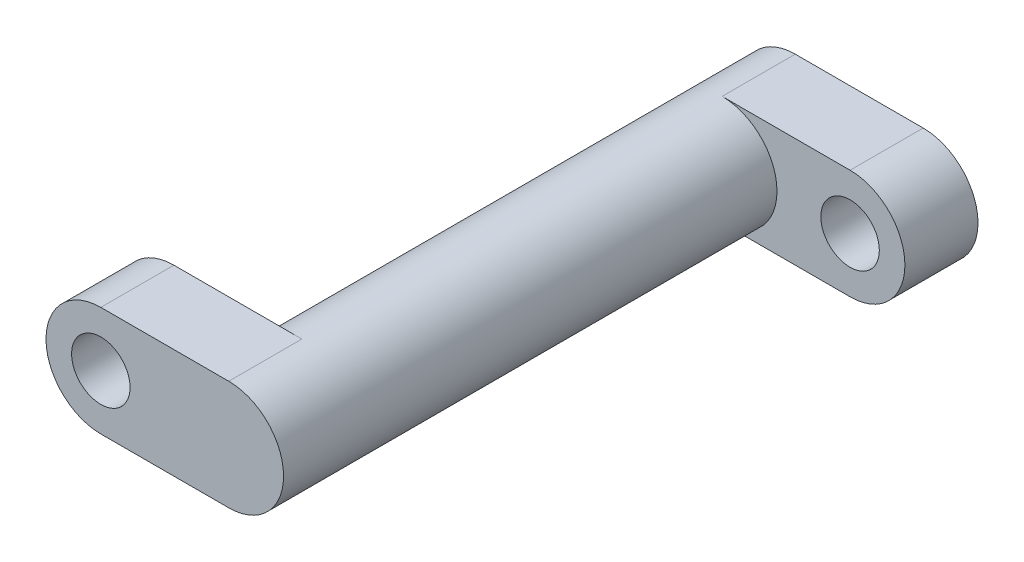
ISO-10303-21;
HEADER;
FILE_DESCRIPTION(('STEP AP214'),'2;1');
FILE_NAME('part.step','',(''),(''),'','','');
FILE_SCHEMA(('AUTOMOTIVE_DESIGN { 1 0 10303 214 1 1 1 1 }'));
ENDSEC;
DATA;
#1=APPLICATION_CONTEXT('core data for automotive mechanical design processes');
#2=APPLICATION_PROTOCOL_DEFINITION('international standard','automotive_design',2000,#1);
#3=PRODUCT_CONTEXT('',#1,'mechanical');
#4=PRODUCT('Part','Part','',(#3));
#5=PRODUCT_RELATED_PRODUCT_CATEGORY('part','',(#4));
#6=PRODUCT_DEFINITION_FORMATION('','',#4);
#7=PRODUCT_DEFINITION_CONTEXT('part definition',#1,'design');
#8=PRODUCT_DEFINITION('design','',#6,#7);
#9=PRODUCT_DEFINITION_SHAPE('','',#8);
#10=(LENGTH_UNIT() NAMED_UNIT(*) SI_UNIT(.MILLI.,.METRE.));
#11=(NAMED_UNIT(*) PLANE_ANGLE_UNIT() SI_UNIT($,.RADIAN.));
#12=(NAMED_UNIT(*) SI_UNIT($,.STERADIAN.) SOLID_ANGLE_UNIT());
#13=UNCERTAINTY_MEASURE_WITH_UNIT(LENGTH_MEASURE(1.E-05),#10,'distance_accuracy_value','');
#14=(GEOMETRIC_REPRESENTATION_CONTEXT(3) GLOBAL_UNCERTAINTY_ASSIGNED_CONTEXT((#13)) GLOBAL_UNIT_ASSIGNED_CONTEXT((#10,
#11,#12)) REPRESENTATION_CONTEXT('',''));
#15=CARTESIAN_POINT('',(0.,0.,0.));
#16=DIRECTION('',(0.,0.,1.));
#17=DIRECTION('',(1.,0.,0.));
#18=AXIS2_PLACEMENT_3D('',#15,#16,#17);
#19=CARTESIAN_POINT('',(-35.79,73.26,3.));
#20=DIRECTION('',(0.,0.,1.));
#21=DIRECTION('',(1.,0.,0.));
#22=AXIS2_PLACEMENT_3D('',#19,#20,#21);
#23=CYLINDRICAL_SURFACE('',#22,1.60000000000001);
#24=CARTESIAN_POINT('',(-35.79,73.26,3.));
#25=DIRECTION('',(0.,0.,1.));
#26=DIRECTION('',(1.,0.,0.));
#27=AXIS2_PLACEMENT_3D('',#24,#25,#26);
#28=CIRCLE('',#27,1.60000000000001);
#29=CARTESIAN_POINT('',(-34.19,73.26,3.));
#30=VERTEX_POINT('',#29);
#31=EDGE_CURVE('E84',#30,#30,#28,.T.);
#32=ORIENTED_EDGE('',*,*,#31,.F.);
#33=EDGE_LOOP('',(#32));
#34=FACE_BOUND('',#33,.T.);
#35=CARTESIAN_POINT('',(-35.79,73.26,7.));
#36=DIRECTION('',(0.,0.,1.));
#37=DIRECTION('',(1.,0.,0.));
#38=AXIS2_PLACEMENT_3D('',#35,#36,#37);
#39=CIRCLE('',#38,1.60000000000001);
#40=CARTESIAN_POINT('',(-34.19,73.26,7.));
#41=VERTEX_POINT('',#40);
#42=EDGE_CURVE('E152',#41,#41,#39,.T.);
#43=ORIENTED_EDGE('',*,*,#42,.T.);
#44=EDGE_LOOP('',(#43));
#45=FACE_BOUND('',#44,.T.);
#46=ADVANCED_FACE('F40',(#34,#45),#23,.F.);
#47=CARTESIAN_POINT('',(-35.79,73.26,3.));
#48=DIRECTION('',(0.,0.,1.));
#49=DIRECTION('',(1.,0.,0.));
#50=AXIS2_PLACEMENT_3D('',#47,#48,#49);
#51=CYLINDRICAL_SURFACE('',#50,3.);
#52=CARTESIAN_POINT('',(-35.79,73.26,7.));
#53=DIRECTION('',(0.,0.,1.));
#54=DIRECTION('',(1.,0.,0.));
#55=AXIS2_PLACEMENT_3D('',#52,#53,#54);
#56=CIRCLE('',#55,3.);
#57=CARTESIAN_POINT('',(-35.79,76.26,7.));
#58=VERTEX_POINT('',#57);
#59=CARTESIAN_POINT('',(-35.79,70.26,7.));
#60=VERTEX_POINT('',#59);
#61=EDGE_CURVE('E140',#58,#60,#56,.T.);
#62=ORIENTED_EDGE('',*,*,#61,.F.);
#63=DIRECTION('',(0.,0.,1.));
#64=VECTOR('',#63,1.);
#65=CARTESIAN_POINT('',(-35.79,76.26,3.));
#66=LINE('',#65,#64);
#67=CARTESIAN_POINT('',(-35.79,76.26,3.));
#68=VERTEX_POINT('',#67);
#69=EDGE_CURVE('E128',#68,#58,#66,.T.);
#70=ORIENTED_EDGE('',*,*,#69,.F.);
#71=CARTESIAN_POINT('',(-35.79,73.26,3.));
#72=DIRECTION('',(0.,0.,1.));
#73=DIRECTION('',(1.,0.,0.));
#74=AXIS2_PLACEMENT_3D('',#71,#72,#73);
#75=CIRCLE('',#74,3.);
#76=CARTESIAN_POINT('',(-35.79,70.26,3.));
#77=VERTEX_POINT('',#76);
#78=EDGE_CURVE('E149',#68,#77,#75,.T.);
#79=ORIENTED_EDGE('',*,*,#78,.T.);
#80=DIRECTION('',(0.,0.,1.));
#81=VECTOR('',#80,1.);
#82=CARTESIAN_POINT('',(-35.79,70.26,3.));
#83=LINE('',#82,#81);
#84=EDGE_CURVE('E148',#77,#60,#83,.T.);
#85=ORIENTED_EDGE('',*,*,#84,.T.);
#86=EDGE_LOOP('',(#62,#70,#79,#85));
#87=FACE_BOUND('',#86,.T.);
#88=ADVANCED_FACE('F170',(#87),#51,.T.);
#89=CARTESIAN_POINT('',(-35.79,70.26,3.));
#90=DIRECTION('',(0.,-1.,0.));
#91=DIRECTION('',(0.,0.,-1.));
#92=AXIS2_PLACEMENT_3D('',#89,#90,#91);
#93=PLANE('',#92);
#94=DIRECTION('',(1.,0.,0.));
#95=VECTOR('',#94,1.);
#96=CARTESIAN_POINT('',(-35.79,70.26,7.));
#97=LINE('',#96,#95);
#98=CARTESIAN_POINT('',(-28.79,70.26,7.));
#99=VERTEX_POINT('',#98);
#100=EDGE_CURVE('E137',#60,#99,#97,.T.);
#101=ORIENTED_EDGE('',*,*,#100,.F.);
#102=ORIENTED_EDGE('',*,*,#84,.F.);
#103=DIRECTION('',(1.,0.,0.));
#104=VECTOR('',#103,1.);
#105=CARTESIAN_POINT('',(-35.79,70.26,3.));
#106=LINE('',#105,#104);
#107=CARTESIAN_POINT('',(-28.79,70.26,3.));
#108=VERTEX_POINT('',#107);
#109=EDGE_CURVE('E145',#77,#108,#106,.T.);
#110=ORIENTED_EDGE('',*,*,#109,.T.);
#111=DIRECTION('',(0.,0.,1.));
#112=VECTOR('',#111,1.);
#113=CARTESIAN_POINT('',(-28.79,70.26,3.));
#114=LINE('',#113,#112);
#115=EDGE_CURVE('E126',#108,#99,#114,.T.);
#116=ORIENTED_EDGE('',*,*,#115,.T.);
#117=EDGE_LOOP('',(#101,#102,#110,#116));
#118=FACE_BOUND('',#117,.T.);
#119=ADVANCED_FACE('F179',(#118),#93,.T.);
#120=CARTESIAN_POINT('',(-35.79,73.26,7.));
#121=DIRECTION('',(0.,0.,1.));
#122=DIRECTION('',(1.,0.,0.));
#123=AXIS2_PLACEMENT_3D('',#120,#121,#122);
#124=PLANE('',#123);
#125=ORIENTED_EDGE('',*,*,#42,.F.);
#126=EDGE_LOOP('',(#125));
#127=FACE_BOUND('',#126,.T.);
#128=ORIENTED_EDGE('',*,*,#61,.T.);
#129=ORIENTED_EDGE('',*,*,#100,.T.);
#130=CARTESIAN_POINT('',(-28.79,73.26,7.));
#131=DIRECTION('',(0.,0.,1.));
#132=DIRECTION('',(1.,0.,0.));
#133=AXIS2_PLACEMENT_3D('',#130,#131,#132);
#134=CIRCLE('',#133,3.);
#135=CARTESIAN_POINT('',(-28.79,76.26,7.));
#136=VERTEX_POINT('',#135);
#137=EDGE_CURVE('E135',#99,#136,#134,.T.);
#138=ORIENTED_EDGE('',*,*,#137,.T.);
#139=DIRECTION('',(-1.,0.,0.));
#140=VECTOR('',#139,1.);
#141=CARTESIAN_POINT('',(-35.79,76.26,7.));
#142=LINE('',#141,#140);
#143=EDGE_CURVE('E132',#136,#58,#142,.T.);
#144=ORIENTED_EDGE('',*,*,#143,.T.);
#145=EDGE_LOOP('',(#128,#129,#138,#144));
#146=FACE_BOUND('',#145,.T.);
#147=ADVANCED_FACE('F183',(#127,#146),#124,.T.);
#148=CARTESIAN_POINT('',(-35.79,76.26,3.));
#149=DIRECTION('',(0.,1.,0.));
#150=DIRECTION('',(0.,0.,1.));
#151=AXIS2_PLACEMENT_3D('',#148,#149,#150);
#152=PLANE('',#151);
#153=ORIENTED_EDGE('',*,*,#143,.F.);
#154=DIRECTION('',(0.,0.,1.));
#155=VECTOR('',#154,1.);
#156=CARTESIAN_POINT('',(-28.79,76.26,3.));
#157=LINE('',#156,#155);
#158=CARTESIAN_POINT('',(-28.79,76.26,3.));
#159=VERTEX_POINT('',#158);
#160=EDGE_CURVE('E112',#159,#136,#157,.T.);
#161=ORIENTED_EDGE('',*,*,#160,.F.);
#162=DIRECTION('',(-1.,0.,0.));
#163=VECTOR('',#162,1.);
#164=CARTESIAN_POINT('',(-35.79,76.26,3.));
#165=LINE('',#164,#163);
#166=EDGE_CURVE('E131',#159,#68,#165,.T.);
#167=ORIENTED_EDGE('',*,*,#166,.T.);
#168=ORIENTED_EDGE('',*,*,#69,.T.);
#169=EDGE_LOOP('',(#153,#161,#167,#168));
#170=FACE_BOUND('',#169,.T.);
#171=ADVANCED_FACE('F188',(#170),#152,.T.);
#172=CARTESIAN_POINT('',(-35.79,73.26,3.));
#173=DIRECTION('',(0.,0.,1.));
#174=DIRECTION('',(1.,0.,0.));
#175=AXIS2_PLACEMENT_3D('',#172,#173,#174);
#176=PLANE('',#175);
#177=CARTESIAN_POINT('',(-28.79,73.26,3.));
#178=DIRECTION('',(0.,0.,-1.));
#179=DIRECTION('',(-1.,0.,0.));
#180=AXIS2_PLACEMENT_3D('',#177,#178,#179);
#181=CIRCLE('',#180,3.00000000000001);
#182=EDGE_CURVE('E116',#108,#159,#181,.T.);
#183=ORIENTED_EDGE('',*,*,#182,.F.);
#184=ORIENTED_EDGE('',*,*,#109,.F.);
#185=ORIENTED_EDGE('',*,*,#78,.F.);
#186=ORIENTED_EDGE('',*,*,#166,.F.);
#187=EDGE_LOOP('',(#183,#184,#185,#186));
#188=FACE_BOUND('',#187,.T.);
#189=ORIENTED_EDGE('',*,*,#31,.T.);
#190=EDGE_LOOP('',(#189));
#191=FACE_BOUND('',#190,.T.);
#192=ADVANCED_FACE('F198',(#188,#191),#176,.F.);
#193=CARTESIAN_POINT('',(-28.79,76.26,-20.));
#194=DIRECTION('',(0.,-1.,0.));
#195=DIRECTION('',(0.,0.,-1.));
#196=AXIS2_PLACEMENT_3D('',#193,#194,#195);
#197=PLANE('',#196);
#198=DIRECTION('',(-1.,0.,0.));
#199=VECTOR('',#198,1.);
#200=CARTESIAN_POINT('',(-28.79,76.26,-24.));
#201=LINE('',#200,#199);
#202=CARTESIAN_POINT('',(-21.79,76.26,-24.));
#203=VERTEX_POINT('',#202);
#204=CARTESIAN_POINT('',(-28.79,76.26,-24.));
#205=VERTEX_POINT('',#204);
#206=EDGE_CURVE('E78',#203,#205,#201,.T.);
#207=ORIENTED_EDGE('',*,*,#206,.T.);
#208=DIRECTION('',(0.,0.,-1.));
#209=VECTOR('',#208,1.);
#210=CARTESIAN_POINT('',(-28.79,76.26,-20.));
#211=LINE('',#210,#209);
#212=CARTESIAN_POINT('',(-28.79,76.26,-20.));
#213=VERTEX_POINT('',#212);
#214=EDGE_CURVE('E102',#213,#205,#211,.T.);
#215=ORIENTED_EDGE('',*,*,#214,.F.);
#216=DIRECTION('',(-1.,0.,0.));
#217=VECTOR('',#216,1.);
#218=CARTESIAN_POINT('',(-28.79,76.26,-20.));
#219=LINE('',#218,#217);
#220=CARTESIAN_POINT('',(-21.79,76.26,-20.));
#221=VERTEX_POINT('',#220);
#222=EDGE_CURVE('E97',#221,#213,#219,.T.);
#223=ORIENTED_EDGE('',*,*,#222,.F.);
#224=DIRECTION('',(0.,0.,-1.));
#225=VECTOR('',#224,1.);
#226=CARTESIAN_POINT('',(-21.79,76.26,-20.));
#227=LINE('',#226,#225);
#228=EDGE_CURVE('E83',#221,#203,#227,.T.);
#229=ORIENTED_EDGE('',*,*,#228,.T.);
#230=EDGE_LOOP('',(#207,#215,#223,#229));
#231=FACE_BOUND('',#230,.T.);
#232=ADVANCED_FACE('F95',(#231),#197,.F.);
#233=CARTESIAN_POINT('',(-21.79,73.26,-20.));
#234=DIRECTION('',(0.,0.,-1.));
#235=DIRECTION('',(-1.,0.,0.));
#236=AXIS2_PLACEMENT_3D('',#233,#234,#235);
#237=CYLINDRICAL_SURFACE('',#236,3.);
#238=CARTESIAN_POINT('',(-21.79,73.26,-24.));
#239=DIRECTION('',(0.,0.,1.));
#240=DIRECTION('',(1.,0.,0.));
#241=AXIS2_PLACEMENT_3D('',#238,#239,#240);
#242=CIRCLE('',#241,3.);
#243=CARTESIAN_POINT('',(-21.79,70.26,-24.));
#244=VERTEX_POINT('',#243);
#245=EDGE_CURVE('E76',#244,#203,#242,.T.);
#246=ORIENTED_EDGE('',*,*,#245,.T.);
#247=ORIENTED_EDGE('',*,*,#228,.F.);
#248=CARTESIAN_POINT('',(-21.79,73.26,-20.));
#249=DIRECTION('',(0.,0.,1.));
#250=DIRECTION('',(1.,0.,0.));
#251=AXIS2_PLACEMENT_3D('',#248,#249,#250);
#252=CIRCLE('',#251,3.);
#253=CARTESIAN_POINT('',(-21.79,70.26,-20.));
#254=VERTEX_POINT('',#253);
#255=EDGE_CURVE('E109',#254,#221,#252,.T.);
#256=ORIENTED_EDGE('',*,*,#255,.F.);
#257=DIRECTION('',(0.,0.,-1.));
#258=VECTOR('',#257,1.);
#259=CARTESIAN_POINT('',(-21.79,70.26,-20.));
#260=LINE('',#259,#258);
#261=EDGE_CURVE('E93',#254,#244,#260,.T.);
#262=ORIENTED_EDGE('',*,*,#261,.T.);
#263=EDGE_LOOP('',(#246,#247,#256,#262));
#264=FACE_BOUND('',#263,.T.);
#265=ADVANCED_FACE('F89',(#264),#237,.T.);
#266=CARTESIAN_POINT('',(-28.79,70.26,-20.));
#267=DIRECTION('',(0.,1.,0.));
#268=DIRECTION('',(0.,0.,1.));
#269=AXIS2_PLACEMENT_3D('',#266,#267,#268);
#270=PLANE('',#269);
#271=DIRECTION('',(1.,0.,0.));
#272=VECTOR('',#271,1.);
#273=CARTESIAN_POINT('',(-28.79,70.26,-24.));
#274=LINE('',#273,#272);
#275=CARTESIAN_POINT('',(-28.79,70.26,-24.));
#276=VERTEX_POINT('',#275);
#277=EDGE_CURVE('E105',#276,#244,#274,.T.);
#278=ORIENTED_EDGE('',*,*,#277,.T.);
#279=ORIENTED_EDGE('',*,*,#261,.F.);
#280=DIRECTION('',(1.,0.,0.));
#281=VECTOR('',#280,1.);
#282=CARTESIAN_POINT('',(-28.79,70.26,-20.));
#283=LINE('',#282,#281);
#284=CARTESIAN_POINT('',(-28.79,70.26,-20.));
#285=VERTEX_POINT('',#284);
#286=EDGE_CURVE('E111',#285,#254,#283,.T.);
#287=ORIENTED_EDGE('',*,*,#286,.F.);
#288=DIRECTION('',(0.,0.,-1.));
#289=VECTOR('',#288,1.);
#290=CARTESIAN_POINT('',(-28.79,70.26,-20.));
#291=LINE('',#290,#289);
#292=EDGE_CURVE('E107',#285,#276,#291,.T.);
#293=ORIENTED_EDGE('',*,*,#292,.T.);
#294=EDGE_LOOP('',(#278,#279,#287,#293));
#295=FACE_BOUND('',#294,.T.);
#296=ADVANCED_FACE('F218',(#295),#270,.F.);
#297=CARTESIAN_POINT('',(-28.79,73.26,-32.4852813742386));
#298=DIRECTION('',(0.,0.,1.));
#299=DIRECTION('',(1.,0.,0.));
#300=AXIS2_PLACEMENT_3D('',#297,#298,#299);
#301=CYLINDRICAL_SURFACE('',#300,3.00000000000001);
#302=CARTESIAN_POINT('',(-28.79,73.26,-20.));
#303=DIRECTION('',(0.,0.,1.));
#304=DIRECTION('',(1.,0.,0.));
#305=AXIS2_PLACEMENT_3D('',#302,#303,#304);
#306=CIRCLE('',#305,3.00000000000001);
#307=EDGE_CURVE('E103',#285,#213,#306,.T.);
#308=ORIENTED_EDGE('',*,*,#307,.T.);
#309=ORIENTED_EDGE('',*,*,#214,.T.);
#310=CARTESIAN_POINT('',(-28.79,73.26,-24.));
#311=DIRECTION('',(0.,0.,1.));
#312=DIRECTION('',(1.,0.,0.));
#313=AXIS2_PLACEMENT_3D('',#310,#311,#312);
#314=CIRCLE('',#313,3.00000000000001);
#315=EDGE_CURVE('E57',#205,#276,#314,.T.);
#316=ORIENTED_EDGE('',*,*,#315,.T.);
#317=ORIENTED_EDGE('',*,*,#292,.F.);
#318=EDGE_LOOP('',(#308,#309,#316,#317));
#319=FACE_BOUND('',#318,.T.);
#320=ORIENTED_EDGE('',*,*,#182,.T.);
#321=ORIENTED_EDGE('',*,*,#160,.T.);
#322=ORIENTED_EDGE('',*,*,#137,.F.);
#323=ORIENTED_EDGE('',*,*,#115,.F.);
#324=EDGE_LOOP('',(#320,#321,#322,#323));
#325=FACE_BOUND('',#324,.T.);
#326=ADVANCED_FACE('F221',(#319,#325),#301,.T.);
#327=CARTESIAN_POINT('',(-28.79,73.26,-20.));
#328=DIRECTION('',(0.,0.,1.));
#329=DIRECTION('',(1.,0.,0.));
#330=AXIS2_PLACEMENT_3D('',#327,#328,#329);
#331=PLANE('',#330);
#332=CARTESIAN_POINT('',(-21.79,73.26,-20.));
#333=DIRECTION('',(0.,0.,1.));
#334=DIRECTION('',(1.,0.,0.));
#335=AXIS2_PLACEMENT_3D('',#332,#333,#334);
#336=CIRCLE('',#335,1.6);
#337=CARTESIAN_POINT('',(-20.19,73.26,-20.));
#338=VERTEX_POINT('',#337);
#339=EDGE_CURVE('E11',#338,#338,#336,.T.);
#340=ORIENTED_EDGE('',*,*,#339,.F.);
#341=EDGE_LOOP('',(#340));
#342=FACE_BOUND('',#341,.T.);
#343=ORIENTED_EDGE('',*,*,#307,.F.);
#344=ORIENTED_EDGE('',*,*,#286,.T.);
#345=ORIENTED_EDGE('',*,*,#255,.T.);
#346=ORIENTED_EDGE('',*,*,#222,.T.);
#347=EDGE_LOOP('',(#343,#344,#345,#346));
#348=FACE_BOUND('',#347,.T.);
#349=ADVANCED_FACE('F226',(#342,#348),#331,.T.);
#350=CARTESIAN_POINT('',(-21.79,73.26,-30.0254833995939));
#351=DIRECTION('',(0.,0.,1.));
#352=DIRECTION('',(1.,0.,0.));
#353=AXIS2_PLACEMENT_3D('',#350,#351,#352);
#354=CYLINDRICAL_SURFACE('',#353,1.6);
#355=CARTESIAN_POINT('',(-21.79,73.26,-24.));
#356=DIRECTION('',(0.,0.,1.));
#357=DIRECTION('',(1.,0.,0.));
#358=AXIS2_PLACEMENT_3D('',#355,#356,#357);
#359=CIRCLE('',#358,1.6);
#360=CARTESIAN_POINT('',(-20.19,73.26,-24.));
#361=VERTEX_POINT('',#360);
#362=EDGE_CURVE('E44',#361,#361,#359,.F.);
#363=ORIENTED_EDGE('',*,*,#362,.T.);
#364=EDGE_LOOP('',(#363));
#365=FACE_BOUND('',#364,.T.);
#366=ORIENTED_EDGE('',*,*,#339,.T.);
#367=EDGE_LOOP('',(#366));
#368=FACE_BOUND('',#367,.T.);
#369=ADVANCED_FACE('F228',(#365,#368),#354,.F.);
#370=CARTESIAN_POINT('',(-60.,-159.299205854416,-24.));
#371=DIRECTION('',(0.,0.,1.));
#372=DIRECTION('',(1.,0.,0.));
#373=AXIS2_PLACEMENT_3D('',#370,#371,#372);
#374=PLANE('',#373);
#375=ORIENTED_EDGE('',*,*,#362,.F.);
#376=EDGE_LOOP('',(#375));
#377=FACE_BOUND('',#376,.T.);
#378=ORIENTED_EDGE('',*,*,#206,.F.);
#379=ORIENTED_EDGE('',*,*,#245,.F.);
#380=ORIENTED_EDGE('',*,*,#277,.F.);
#381=ORIENTED_EDGE('',*,*,#315,.F.);
#382=EDGE_LOOP('',(#378,#379,#380,#381));
#383=FACE_BOUND('',#382,.T.);
#384=ADVANCED_FACE('F42',(#377,#383),#374,.F.);
#385=CLOSED_SHELL('',(#46,#88,#119,#147,#171,#192,#232,#265,#296,#326,#349,#369,#384));
#386=MANIFOLD_SOLID_BREP('B2',#385);
#387=ADVANCED_BREP_SHAPE_REPRESENTATION('',(#18,#386),#14);
#388=SHAPE_DEFINITION_REPRESENTATION(#9,#387);
ENDSEC;
END-ISO-10303-21;
